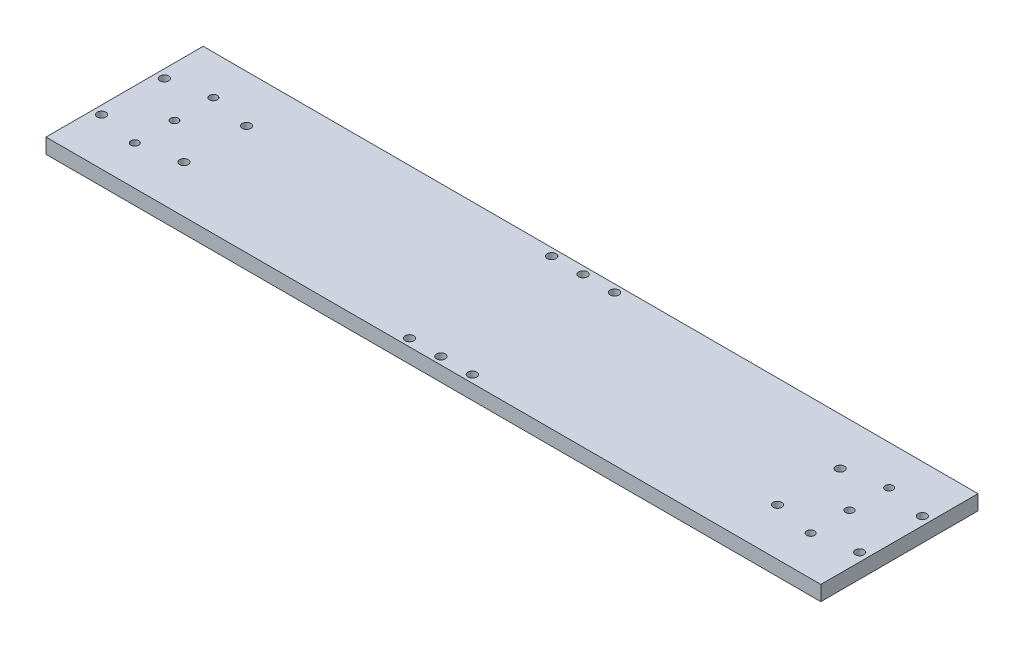
ISO-10303-21;
HEADER;
FILE_DESCRIPTION(('STEP AP214'),'2;1');
FILE_NAME('part.step','',(''),(''),'','','');
FILE_SCHEMA(('AUTOMOTIVE_DESIGN { 1 0 10303 214 1 1 1 1 }'));
ENDSEC;
DATA;
#1=APPLICATION_CONTEXT('core data for automotive mechanical design processes');
#2=APPLICATION_PROTOCOL_DEFINITION('international standard','automotive_design',2000,#1);
#3=PRODUCT_CONTEXT('',#1,'mechanical');
#4=PRODUCT('Part','Part','',(#3));
#5=PRODUCT_RELATED_PRODUCT_CATEGORY('part','',(#4));
#6=PRODUCT_DEFINITION_FORMATION('','',#4);
#7=PRODUCT_DEFINITION_CONTEXT('part definition',#1,'design');
#8=PRODUCT_DEFINITION('design','',#6,#7);
#9=PRODUCT_DEFINITION_SHAPE('','',#8);
#10=(LENGTH_UNIT() NAMED_UNIT(*) SI_UNIT(.MILLI.,.METRE.));
#11=(NAMED_UNIT(*) PLANE_ANGLE_UNIT() SI_UNIT($,.RADIAN.));
#12=(NAMED_UNIT(*) SI_UNIT($,.STERADIAN.) SOLID_ANGLE_UNIT());
#13=UNCERTAINTY_MEASURE_WITH_UNIT(LENGTH_MEASURE(1.E-05),#10,'distance_accuracy_value','');
#14=(GEOMETRIC_REPRESENTATION_CONTEXT(3) GLOBAL_UNCERTAINTY_ASSIGNED_CONTEXT((#13)) GLOBAL_UNIT_ASSIGNED_CONTEXT((#10,
#11,#12)) REPRESENTATION_CONTEXT('',''));
#15=CARTESIAN_POINT('',(0.,0.,0.));
#16=DIRECTION('',(0.,0.,1.));
#17=DIRECTION('',(1.,0.,0.));
#18=AXIS2_PLACEMENT_3D('',#15,#16,#17);
#19=CARTESIAN_POINT('',(-215.,-8.825,0.));
#20=DIRECTION('',(0.,1.,0.));
#21=DIRECTION('',(0.,0.,1.));
#22=AXIS2_PLACEMENT_3D('',#19,#20,#21);
#23=PLANE('',#22);
#24=CARTESIAN_POINT('',(-214.762500000001,-8.825,-3.71790761220109E-13));
#25=DIRECTION('',(0.,-1.,0.));
#26=DIRECTION('',(0.,0.,1.));
#27=AXIS2_PLACEMENT_3D('',#24,#25,#26);
#28=CIRCLE('',#27,4.99999999999996);
#29=CARTESIAN_POINT('',(-214.881249999992,-8.825,4.99858964483963));
#30=VERTEX_POINT('',#29);
#31=CARTESIAN_POINT('',(-214.881250000007,-8.825,-4.99858964484001));
#32=VERTEX_POINT('',#31);
#33=EDGE_CURVE('E89',#30,#32,#28,.T.);
#34=ORIENTED_EDGE('',*,*,#33,.F.);
#35=CARTESIAN_POINT('',(-215.,-8.825,0.));
#36=DIRECTION('',(0.,-1.,0.));
#37=DIRECTION('',(0.,0.,1.));
#38=AXIS2_PLACEMENT_3D('',#35,#36,#37);
#39=CIRCLE('',#38,4.99999999999999);
#40=EDGE_CURVE('E97',#30,#32,#39,.T.);
#41=ORIENTED_EDGE('',*,*,#40,.T.);
#42=EDGE_LOOP('',(#34,#41));
#43=FACE_BOUND('',#42,.T.);
#44=ADVANCED_FACE('F33',(#43),#23,.F.);
#45=CARTESIAN_POINT('',(-391.422152239449,-9.525,50.));
#46=DIRECTION('',(0.,0.,1.));
#47=DIRECTION('',(1.,0.,0.));
#48=AXIS2_PLACEMENT_3D('',#45,#46,#47);
#49=PLANE('',#48);
#50=DIRECTION('',(1.,0.,0.));
#51=VECTOR('',#50,1.);
#52=CARTESIAN_POINT('',(-391.422152239449,0.,50.));
#53=LINE('',#52,#51);
#54=CARTESIAN_POINT('',(-246.505,0.,50.));
#55=VERTEX_POINT('',#54);
#56=CARTESIAN_POINT('',(246.505,0.,50.));
#57=VERTEX_POINT('',#56);
#58=EDGE_CURVE('E191',#55,#57,#53,.T.);
#59=ORIENTED_EDGE('',*,*,#58,.F.);
#60=DIRECTION('',(0.,1.,0.));
#61=VECTOR('',#60,1.);
#62=CARTESIAN_POINT('',(-246.505,-9.525,50.));
#63=LINE('',#62,#61);
#64=CARTESIAN_POINT('',(-246.505,-9.525,50.));
#65=VERTEX_POINT('',#64);
#66=EDGE_CURVE('E11',#65,#55,#63,.T.);
#67=ORIENTED_EDGE('',*,*,#66,.F.);
#68=DIRECTION('',(1.,0.,0.));
#69=VECTOR('',#68,1.);
#70=CARTESIAN_POINT('',(-391.422152239449,-9.525,50.));
#71=LINE('',#70,#69);
#72=CARTESIAN_POINT('',(246.505,-9.525,50.));
#73=VERTEX_POINT('',#72);
#74=EDGE_CURVE('E192',#65,#73,#71,.T.);
#75=ORIENTED_EDGE('',*,*,#74,.T.);
#76=DIRECTION('',(0.,1.,0.));
#77=VECTOR('',#76,1.);
#78=CARTESIAN_POINT('',(246.505,-9.525,50.));
#79=LINE('',#78,#77);
#80=EDGE_CURVE('E203',#73,#57,#79,.T.);
#81=ORIENTED_EDGE('',*,*,#80,.T.);
#82=EDGE_LOOP('',(#59,#67,#75,#81));
#83=FACE_BOUND('',#82,.T.);
#84=ADVANCED_FACE('F35',(#83),#49,.T.);
#85=CARTESIAN_POINT('',(-246.505,-9.525,0.));
#86=DIRECTION('',(1.,0.,0.));
#87=DIRECTION('',(0.,0.,-1.));
#88=AXIS2_PLACEMENT_3D('',#85,#86,#87);
#89=PLANE('',#88);
#90=DIRECTION('',(0.,0.,-1.));
#91=VECTOR('',#90,1.);
#92=CARTESIAN_POINT('',(-246.505,0.,0.));
#93=LINE('',#92,#91);
#94=CARTESIAN_POINT('',(-246.505,0.,-50.));
#95=VERTEX_POINT('',#94);
#96=EDGE_CURVE('E196',#55,#95,#93,.T.);
#97=ORIENTED_EDGE('',*,*,#96,.T.);
#98=DIRECTION('',(0.,1.,0.));
#99=VECTOR('',#98,1.);
#100=CARTESIAN_POINT('',(-246.505,-9.525,-50.));
#101=LINE('',#100,#99);
#102=CARTESIAN_POINT('',(-246.505,-9.525,-50.));
#103=VERTEX_POINT('',#102);
#104=EDGE_CURVE('E42',#103,#95,#101,.T.);
#105=ORIENTED_EDGE('',*,*,#104,.F.);
#106=DIRECTION('',(0.,0.,-1.));
#107=VECTOR('',#106,1.);
#108=CARTESIAN_POINT('',(-246.505,-9.525,0.));
#109=LINE('',#108,#107);
#110=EDGE_CURVE('E201',#65,#103,#109,.T.);
#111=ORIENTED_EDGE('',*,*,#110,.F.);
#112=ORIENTED_EDGE('',*,*,#66,.T.);
#113=EDGE_LOOP('',(#97,#105,#111,#112));
#114=FACE_BOUND('',#113,.T.);
#115=ADVANCED_FACE('F282',(#114),#89,.F.);
#116=CARTESIAN_POINT('',(-391.422152239449,-9.525,-50.));
#117=DIRECTION('',(0.,0.,1.));
#118=DIRECTION('',(1.,0.,0.));
#119=AXIS2_PLACEMENT_3D('',#116,#117,#118);
#120=PLANE('',#119);
#121=DIRECTION('',(1.,0.,0.));
#122=VECTOR('',#121,1.);
#123=CARTESIAN_POINT('',(-391.422152239449,0.,-50.));
#124=LINE('',#123,#122);
#125=CARTESIAN_POINT('',(246.505,0.,-50.));
#126=VERTEX_POINT('',#125);
#127=EDGE_CURVE('E209',#95,#126,#124,.T.);
#128=ORIENTED_EDGE('',*,*,#127,.T.);
#129=DIRECTION('',(0.,1.,0.));
#130=VECTOR('',#129,1.);
#131=CARTESIAN_POINT('',(246.505,-9.525,-50.));
#132=LINE('',#131,#130);
#133=CARTESIAN_POINT('',(246.505,-9.525,-50.));
#134=VERTEX_POINT('',#133);
#135=EDGE_CURVE('E215',#134,#126,#132,.T.);
#136=ORIENTED_EDGE('',*,*,#135,.F.);
#137=DIRECTION('',(1.,0.,0.));
#138=VECTOR('',#137,1.);
#139=CARTESIAN_POINT('',(-391.422152239449,-9.525,-50.));
#140=LINE('',#139,#138);
#141=EDGE_CURVE('E199',#103,#134,#140,.T.);
#142=ORIENTED_EDGE('',*,*,#141,.F.);
#143=ORIENTED_EDGE('',*,*,#104,.T.);
#144=EDGE_LOOP('',(#128,#136,#142,#143));
#145=FACE_BOUND('',#144,.T.);
#146=ADVANCED_FACE('F279',(#145),#120,.F.);
#147=CARTESIAN_POINT('',(246.505,-9.525,0.));
#148=DIRECTION('',(1.,0.,0.));
#149=DIRECTION('',(0.,0.,-1.));
#150=AXIS2_PLACEMENT_3D('',#147,#148,#149);
#151=PLANE('',#150);
#152=DIRECTION('',(0.,0.,-1.));
#153=VECTOR('',#152,1.);
#154=CARTESIAN_POINT('',(246.505,0.,0.));
#155=LINE('',#154,#153);
#156=EDGE_CURVE('E206',#57,#126,#155,.T.);
#157=ORIENTED_EDGE('',*,*,#156,.F.);
#158=ORIENTED_EDGE('',*,*,#80,.F.);
#159=DIRECTION('',(0.,0.,-1.));
#160=VECTOR('',#159,1.);
#161=CARTESIAN_POINT('',(246.505,-9.525,0.));
#162=LINE('',#161,#160);
#163=EDGE_CURVE('E195',#73,#134,#162,.T.);
#164=ORIENTED_EDGE('',*,*,#163,.T.);
#165=ORIENTED_EDGE('',*,*,#135,.T.);
#166=EDGE_LOOP('',(#157,#158,#164,#165));
#167=FACE_BOUND('',#166,.T.);
#168=ADVANCED_FACE('F275',(#167),#151,.T.);
#169=CARTESIAN_POINT('',(-391.422152239449,-9.525,0.));
#170=DIRECTION('',(0.,1.,0.));
#171=DIRECTION('',(0.,0.,1.));
#172=AXIS2_PLACEMENT_3D('',#169,#170,#171);
#173=PLANE('',#172);
#174=CARTESIAN_POINT('',(-215.000000000003,-9.525,24.9999999999989));
#175=DIRECTION('',(0.,-1.,0.));
#176=DIRECTION('',(0.,0.,1.));
#177=AXIS2_PLACEMENT_3D('',#174,#175,#176);
#178=CIRCLE('',#177,5.00000000000002);
#179=CARTESIAN_POINT('',(-215.000000000003,-9.525,29.9999999999989));
#180=VERTEX_POINT('',#179);
#181=EDGE_CURVE('E109',#180,#180,#178,.T.);
#182=ORIENTED_EDGE('',*,*,#181,.F.);
#183=EDGE_LOOP('',(#182));
#184=FACE_BOUND('',#183,.T.);
#185=CARTESIAN_POINT('',(-215.,-9.525,0.));
#186=DIRECTION('',(0.,-1.,0.));
#187=DIRECTION('',(0.,0.,1.));
#188=AXIS2_PLACEMENT_3D('',#185,#186,#187);
#189=CIRCLE('',#188,4.99999999999999);
#190=CARTESIAN_POINT('',(-215.,-9.525,4.99999999999998));
#191=VERTEX_POINT('',#190);
#192=EDGE_CURVE('E99',#191,#191,#189,.T.);
#193=ORIENTED_EDGE('',*,*,#192,.F.);
#194=EDGE_LOOP('',(#193));
#195=FACE_BOUND('',#194,.T.);
#196=CARTESIAN_POINT('',(-215.000000000003,-9.525,-25.000000000001));
#197=DIRECTION('',(0.,-1.,0.));
#198=DIRECTION('',(0.,0.,1.));
#199=AXIS2_PLACEMENT_3D('',#196,#197,#198);
#200=CIRCLE('',#199,5.00000000000002);
#201=CARTESIAN_POINT('',(-215.000000000003,-9.525,-20.000000000001));
#202=VERTEX_POINT('',#201);
#203=EDGE_CURVE('E103',#202,#202,#200,.T.);
#204=ORIENTED_EDGE('',*,*,#203,.F.);
#205=EDGE_LOOP('',(#204));
#206=FACE_BOUND('',#205,.T.);
#207=CARTESIAN_POINT('',(215.000000000003,-9.525,-25.000000000001));
#208=DIRECTION('',(0.,-1.,0.));
#209=DIRECTION('',(0.,0.,-1.));
#210=AXIS2_PLACEMENT_3D('',#207,#208,#209);
#211=CIRCLE('',#210,5.00000000000002);
#212=CARTESIAN_POINT('',(215.000000000003,-9.525,-30.000000000001));
#213=VERTEX_POINT('',#212);
#214=EDGE_CURVE('E105',#213,#213,#211,.T.);
#215=ORIENTED_EDGE('',*,*,#214,.F.);
#216=EDGE_LOOP('',(#215));
#217=FACE_BOUND('',#216,.T.);
#218=CARTESIAN_POINT('',(215.,-9.525,0.));
#219=DIRECTION('',(0.,-1.,0.));
#220=DIRECTION('',(0.,0.,-1.));
#221=AXIS2_PLACEMENT_3D('',#218,#219,#220);
#222=CIRCLE('',#221,4.99999999999999);
#223=CARTESIAN_POINT('',(215.,-9.525,-5.));
#224=VERTEX_POINT('',#223);
#225=EDGE_CURVE('E115',#224,#224,#222,.T.);
#226=ORIENTED_EDGE('',*,*,#225,.F.);
#227=EDGE_LOOP('',(#226));
#228=FACE_BOUND('',#227,.T.);
#229=CARTESIAN_POINT('',(215.000000000003,-9.525,24.9999999999989));
#230=DIRECTION('',(0.,-1.,0.));
#231=DIRECTION('',(0.,0.,-1.));
#232=AXIS2_PLACEMENT_3D('',#229,#230,#231);
#233=CIRCLE('',#232,5.00000000000002);
#234=CARTESIAN_POINT('',(215.000000000003,-9.525,19.9999999999988));
#235=VERTEX_POINT('',#234);
#236=EDGE_CURVE('E118',#235,#235,#233,.T.);
#237=ORIENTED_EDGE('',*,*,#236,.F.);
#238=EDGE_LOOP('',(#237));
#239=FACE_BOUND('',#238,.T.);
#240=CARTESIAN_POINT('',(188.84,-9.525,19.9509032471845));
#241=DIRECTION('',(0.,-1.,0.));
#242=DIRECTION('',(0.,0.,1.));
#243=AXIS2_PLACEMENT_3D('',#240,#241,#242);
#244=CIRCLE('',#243,2.75000000000001);
#245=CARTESIAN_POINT('',(188.84,-9.525,22.7009032471845));
#246=VERTEX_POINT('',#245);
#247=EDGE_CURVE('E124',#246,#246,#244,.T.);
#248=ORIENTED_EDGE('',*,*,#247,.F.);
#249=EDGE_LOOP('',(#248));
#250=FACE_BOUND('',#249,.T.);
#251=CARTESIAN_POINT('',(188.84,-9.525,-19.9499999999998));
#252=DIRECTION('',(0.,-1.,0.));
#253=DIRECTION('',(0.,0.,1.));
#254=AXIS2_PLACEMENT_3D('',#251,#252,#253);
#255=CIRCLE('',#254,2.75000000000001);
#256=CARTESIAN_POINT('',(188.84,-9.525,-17.1999999999998));
#257=VERTEX_POINT('',#256);
#258=EDGE_CURVE('E127',#257,#257,#255,.T.);
#259=ORIENTED_EDGE('',*,*,#258,.F.);
#260=EDGE_LOOP('',(#259));
#261=FACE_BOUND('',#260,.T.);
#262=CARTESIAN_POINT('',(241.16,-9.525,19.9509032471845));
#263=DIRECTION('',(0.,-1.,0.));
#264=DIRECTION('',(0.,0.,1.));
#265=AXIS2_PLACEMENT_3D('',#262,#263,#264);
#266=CIRCLE('',#265,2.75000000000001);
#267=CARTESIAN_POINT('',(241.16,-9.525,22.7009032471845));
#268=VERTEX_POINT('',#267);
#269=EDGE_CURVE('E131',#268,#268,#266,.T.);
#270=ORIENTED_EDGE('',*,*,#269,.F.);
#271=EDGE_LOOP('',(#270));
#272=FACE_BOUND('',#271,.T.);
#273=CARTESIAN_POINT('',(241.16,-9.525,-19.9499999999998));
#274=DIRECTION('',(0.,-1.,0.));
#275=DIRECTION('',(0.,0.,1.));
#276=AXIS2_PLACEMENT_3D('',#273,#274,#275);
#277=CIRCLE('',#276,2.75000000000001);
#278=CARTESIAN_POINT('',(241.16,-9.525,-17.1999999999998));
#279=VERTEX_POINT('',#278);
#280=EDGE_CURVE('E135',#279,#279,#277,.T.);
#281=ORIENTED_EDGE('',*,*,#280,.F.);
#282=EDGE_LOOP('',(#281));
#283=FACE_BOUND('',#282,.T.);
#284=CARTESIAN_POINT('',(-241.16,-9.525,-19.9499999999999));
#285=DIRECTION('',(0.,-1.,0.));
#286=DIRECTION('',(0.,0.,-1.));
#287=AXIS2_PLACEMENT_3D('',#284,#285,#286);
#288=CIRCLE('',#287,2.75000000000001);
#289=CARTESIAN_POINT('',(-241.16,-9.525,-22.6999999999999));
#290=VERTEX_POINT('',#289);
#291=EDGE_CURVE('E139',#290,#290,#288,.T.);
#292=ORIENTED_EDGE('',*,*,#291,.F.);
#293=EDGE_LOOP('',(#292));
#294=FACE_BOUND('',#293,.T.);
#295=CARTESIAN_POINT('',(-241.16,-9.525,19.9509032471845));
#296=DIRECTION('',(0.,-1.,0.));
#297=DIRECTION('',(0.,0.,-1.));
#298=AXIS2_PLACEMENT_3D('',#295,#296,#297);
#299=CIRCLE('',#298,2.75000000000001);
#300=CARTESIAN_POINT('',(-241.16,-9.525,17.2009032471845));
#301=VERTEX_POINT('',#300);
#302=EDGE_CURVE('E143',#301,#301,#299,.T.);
#303=ORIENTED_EDGE('',*,*,#302,.F.);
#304=EDGE_LOOP('',(#303));
#305=FACE_BOUND('',#304,.T.);
#306=CARTESIAN_POINT('',(-188.84,-9.525,-19.9499999999999));
#307=DIRECTION('',(0.,-1.,0.));
#308=DIRECTION('',(0.,0.,-1.));
#309=AXIS2_PLACEMENT_3D('',#306,#307,#308);
#310=CIRCLE('',#309,2.75000000000001);
#311=CARTESIAN_POINT('',(-188.84,-9.525,-22.6999999999999));
#312=VERTEX_POINT('',#311);
#313=EDGE_CURVE('E147',#312,#312,#310,.T.);
#314=ORIENTED_EDGE('',*,*,#313,.F.);
#315=EDGE_LOOP('',(#314));
#316=FACE_BOUND('',#315,.T.);
#317=CARTESIAN_POINT('',(-188.84,-9.525,19.9509032471845));
#318=DIRECTION('',(0.,-1.,0.));
#319=DIRECTION('',(0.,0.,-1.));
#320=AXIS2_PLACEMENT_3D('',#317,#318,#319);
#321=CIRCLE('',#320,2.75000000000001);
#322=CARTESIAN_POINT('',(-188.84,-9.525,17.2009032471845));
#323=VERTEX_POINT('',#322);
#324=EDGE_CURVE('E151',#323,#323,#321,.T.);
#325=ORIENTED_EDGE('',*,*,#324,.F.);
#326=EDGE_LOOP('',(#325));
#327=FACE_BOUND('',#326,.T.);
#328=CARTESIAN_POINT('',(0.,-9.525,-45.235));
#329=DIRECTION('',(0.,1.,0.));
#330=DIRECTION('',(0.,0.,1.));
#331=AXIS2_PLACEMENT_3D('',#328,#329,#330);
#332=CIRCLE('',#331,2.78);
#333=CARTESIAN_POINT('',(0.,-9.525,-42.455));
#334=VERTEX_POINT('',#333);
#335=EDGE_CURVE('E158',#334,#334,#332,.T.);
#336=ORIENTED_EDGE('',*,*,#335,.T.);
#337=EDGE_LOOP('',(#336));
#338=FACE_BOUND('',#337,.T.);
#339=CARTESIAN_POINT('',(20.,-9.525,-45.235));
#340=DIRECTION('',(0.,1.,0.));
#341=DIRECTION('',(0.,0.,1.));
#342=AXIS2_PLACEMENT_3D('',#339,#340,#341);
#343=CIRCLE('',#342,2.78);
#344=CARTESIAN_POINT('',(20.,-9.525,-42.455));
#345=VERTEX_POINT('',#344);
#346=EDGE_CURVE('E164',#345,#345,#343,.T.);
#347=ORIENTED_EDGE('',*,*,#346,.T.);
#348=EDGE_LOOP('',(#347));
#349=FACE_BOUND('',#348,.T.);
#350=CARTESIAN_POINT('',(-20.,-9.525,-45.235));
#351=DIRECTION('',(0.,1.,0.));
#352=DIRECTION('',(0.,0.,1.));
#353=AXIS2_PLACEMENT_3D('',#350,#351,#352);
#354=CIRCLE('',#353,2.78);
#355=CARTESIAN_POINT('',(-20.,-9.525,-42.455));
#356=VERTEX_POINT('',#355);
#357=EDGE_CURVE('E170',#356,#356,#354,.T.);
#358=ORIENTED_EDGE('',*,*,#357,.T.);
#359=EDGE_LOOP('',(#358));
#360=FACE_BOUND('',#359,.T.);
#361=CARTESIAN_POINT('',(20.,-9.525,45.235));
#362=DIRECTION('',(0.,1.,0.));
#363=DIRECTION('',(0.,0.,1.));
#364=AXIS2_PLACEMENT_3D('',#361,#362,#363);
#365=CIRCLE('',#364,2.78);
#366=CARTESIAN_POINT('',(20.,-9.525,48.015));
#367=VERTEX_POINT('',#366);
#368=EDGE_CURVE('E176',#367,#367,#365,.T.);
#369=ORIENTED_EDGE('',*,*,#368,.T.);
#370=EDGE_LOOP('',(#369));
#371=FACE_BOUND('',#370,.T.);
#372=CARTESIAN_POINT('',(-20.,-9.525,45.235));
#373=DIRECTION('',(0.,1.,0.));
#374=DIRECTION('',(0.,0.,1.));
#375=AXIS2_PLACEMENT_3D('',#372,#373,#374);
#376=CIRCLE('',#375,2.78);
#377=CARTESIAN_POINT('',(-20.,-9.525,48.015));
#378=VERTEX_POINT('',#377);
#379=EDGE_CURVE('E182',#378,#378,#376,.T.);
#380=ORIENTED_EDGE('',*,*,#379,.T.);
#381=EDGE_LOOP('',(#380));
#382=FACE_BOUND('',#381,.T.);
#383=CARTESIAN_POINT('',(0.,-9.525,45.235));
#384=DIRECTION('',(0.,1.,0.));
#385=DIRECTION('',(0.,0.,1.));
#386=AXIS2_PLACEMENT_3D('',#383,#384,#385);
#387=CIRCLE('',#386,2.78);
#388=CARTESIAN_POINT('',(0.,-9.525,48.015));
#389=VERTEX_POINT('',#388);
#390=EDGE_CURVE('E188',#389,#389,#387,.T.);
#391=ORIENTED_EDGE('',*,*,#390,.T.);
#392=EDGE_LOOP('',(#391));
#393=FACE_BOUND('',#392,.T.);
#394=ORIENTED_EDGE('',*,*,#74,.F.);
#395=ORIENTED_EDGE('',*,*,#110,.T.);
#396=ORIENTED_EDGE('',*,*,#141,.T.);
#397=ORIENTED_EDGE('',*,*,#163,.F.);
#398=EDGE_LOOP('',(#394,#395,#396,#397));
#399=FACE_BOUND('',#398,.T.);
#400=ADVANCED_FACE('F239',(#184,#195,#206,#217,#228,#239,#250,#261,#272,#283,#294,#305,#316,
#327,#338,#349,#360,#371,#382,#393,#399),#173,.F.);
#401=CARTESIAN_POINT('',(-391.422152239449,0.,0.));
#402=DIRECTION('',(0.,1.,0.));
#403=DIRECTION('',(0.,0.,1.));
#404=AXIS2_PLACEMENT_3D('',#401,#402,#403);
#405=PLANE('',#404);
#406=CARTESIAN_POINT('',(-215.000000000003,0.,24.9999999999989));
#407=DIRECTION('',(0.,1.,0.));
#408=DIRECTION('',(0.,0.,1.));
#409=AXIS2_PLACEMENT_3D('',#406,#407,#408);
#410=CIRCLE('',#409,2.5);
#411=CARTESIAN_POINT('',(-215.000000000003,0.,27.4999999999989));
#412=VERTEX_POINT('',#411);
#413=EDGE_CURVE('E717',#412,#412,#410,.T.);
#414=ORIENTED_EDGE('',*,*,#413,.F.);
#415=EDGE_LOOP('',(#414));
#416=FACE_BOUND('',#415,.T.);
#417=CARTESIAN_POINT('',(-214.762500000001,0.,-3.19189119579733E-13));
#418=DIRECTION('',(0.,1.,0.));
#419=DIRECTION('',(0.,0.,1.));
#420=AXIS2_PLACEMENT_3D('',#417,#418,#419);
#421=CIRCLE('',#420,2.5);
#422=CARTESIAN_POINT('',(-214.762500000001,0.,2.49999999999968));
#423=VERTEX_POINT('',#422);
#424=EDGE_CURVE('E727',#423,#423,#421,.T.);
#425=ORIENTED_EDGE('',*,*,#424,.F.);
#426=EDGE_LOOP('',(#425));
#427=FACE_BOUND('',#426,.T.);
#428=CARTESIAN_POINT('',(-215.000000000003,0.,-25.000000000001));
#429=DIRECTION('',(0.,1.,0.));
#430=DIRECTION('',(0.,0.,1.));
#431=AXIS2_PLACEMENT_3D('',#428,#429,#430);
#432=CIRCLE('',#431,2.5);
#433=CARTESIAN_POINT('',(-215.000000000003,0.,-22.500000000001));
#434=VERTEX_POINT('',#433);
#435=EDGE_CURVE('E733',#434,#434,#432,.T.);
#436=ORIENTED_EDGE('',*,*,#435,.F.);
#437=EDGE_LOOP('',(#436));
#438=FACE_BOUND('',#437,.T.);
#439=CARTESIAN_POINT('',(215.000000000003,0.,-25.000000000001));
#440=DIRECTION('',(0.,1.,0.));
#441=DIRECTION('',(0.,0.,1.));
#442=AXIS2_PLACEMENT_3D('',#439,#440,#441);
#443=CIRCLE('',#442,2.5);
#444=CARTESIAN_POINT('',(215.000000000003,0.,-22.500000000001));
#445=VERTEX_POINT('',#444);
#446=EDGE_CURVE('E739',#445,#445,#443,.T.);
#447=ORIENTED_EDGE('',*,*,#446,.F.);
#448=EDGE_LOOP('',(#447));
#449=FACE_BOUND('',#448,.T.);
#450=CARTESIAN_POINT('',(214.762500000001,0.,-3.19189119579733E-13));
#451=DIRECTION('',(0.,1.,0.));
#452=DIRECTION('',(0.,0.,1.));
#453=AXIS2_PLACEMENT_3D('',#450,#451,#452);
#454=CIRCLE('',#453,2.5);
#455=CARTESIAN_POINT('',(214.762500000001,0.,2.49999999999968));
#456=VERTEX_POINT('',#455);
#457=EDGE_CURVE('E745',#456,#456,#454,.T.);
#458=ORIENTED_EDGE('',*,*,#457,.F.);
#459=EDGE_LOOP('',(#458));
#460=FACE_BOUND('',#459,.T.);
#461=CARTESIAN_POINT('',(215.000000000003,0.,24.9999999999989));
#462=DIRECTION('',(0.,1.,0.));
#463=DIRECTION('',(0.,0.,1.));
#464=AXIS2_PLACEMENT_3D('',#461,#462,#463);
#465=CIRCLE('',#464,2.5);
#466=CARTESIAN_POINT('',(215.000000000003,0.,27.4999999999989));
#467=VERTEX_POINT('',#466);
#468=EDGE_CURVE('E751',#467,#467,#465,.T.);
#469=ORIENTED_EDGE('',*,*,#468,.F.);
#470=EDGE_LOOP('',(#469));
#471=FACE_BOUND('',#470,.T.);
#472=CARTESIAN_POINT('',(188.84,0.,19.9509032471845));
#473=DIRECTION('',(0.,1.,0.));
#474=DIRECTION('',(0.,0.,1.));
#475=AXIS2_PLACEMENT_3D('',#472,#473,#474);
#476=CIRCLE('',#475,2.75000000000001);
#477=CARTESIAN_POINT('',(188.84,0.,22.7009032471845));
#478=VERTEX_POINT('',#477);
#479=EDGE_CURVE('E37',#478,#478,#476,.T.);
#480=ORIENTED_EDGE('',*,*,#479,.F.);
#481=EDGE_LOOP('',(#480));
#482=FACE_BOUND('',#481,.T.);
#483=CARTESIAN_POINT('',(188.84,0.,-19.9499999999998));
#484=DIRECTION('',(0.,1.,0.));
#485=DIRECTION('',(0.,0.,1.));
#486=AXIS2_PLACEMENT_3D('',#483,#484,#485);
#487=CIRCLE('',#486,2.75000000000001);
#488=CARTESIAN_POINT('',(188.84,0.,-17.1999999999998));
#489=VERTEX_POINT('',#488);
#490=EDGE_CURVE('E130',#489,#489,#487,.T.);
#491=ORIENTED_EDGE('',*,*,#490,.F.);
#492=EDGE_LOOP('',(#491));
#493=FACE_BOUND('',#492,.T.);
#494=CARTESIAN_POINT('',(241.16,0.,19.9509032471845));
#495=DIRECTION('',(0.,1.,0.));
#496=DIRECTION('',(0.,0.,1.));
#497=AXIS2_PLACEMENT_3D('',#494,#495,#496);
#498=CIRCLE('',#497,2.75000000000001);
#499=CARTESIAN_POINT('',(241.16,0.,22.7009032471845));
#500=VERTEX_POINT('',#499);
#501=EDGE_CURVE('E134',#500,#500,#498,.T.);
#502=ORIENTED_EDGE('',*,*,#501,.F.);
#503=EDGE_LOOP('',(#502));
#504=FACE_BOUND('',#503,.T.);
#505=CARTESIAN_POINT('',(241.16,0.,-19.9499999999998));
#506=DIRECTION('',(0.,1.,0.));
#507=DIRECTION('',(0.,0.,1.));
#508=AXIS2_PLACEMENT_3D('',#505,#506,#507);
#509=CIRCLE('',#508,2.75000000000001);
#510=CARTESIAN_POINT('',(241.16,0.,-17.1999999999998));
#511=VERTEX_POINT('',#510);
#512=EDGE_CURVE('E138',#511,#511,#509,.T.);
#513=ORIENTED_EDGE('',*,*,#512,.F.);
#514=EDGE_LOOP('',(#513));
#515=FACE_BOUND('',#514,.T.);
#516=CARTESIAN_POINT('',(-241.16,0.,-19.9499999999999));
#517=DIRECTION('',(0.,1.,0.));
#518=DIRECTION('',(0.,0.,1.));
#519=AXIS2_PLACEMENT_3D('',#516,#517,#518);
#520=CIRCLE('',#519,2.75000000000001);
#521=CARTESIAN_POINT('',(-241.16,0.,-17.1999999999999));
#522=VERTEX_POINT('',#521);
#523=EDGE_CURVE('E142',#522,#522,#520,.T.);
#524=ORIENTED_EDGE('',*,*,#523,.F.);
#525=EDGE_LOOP('',(#524));
#526=FACE_BOUND('',#525,.T.);
#527=CARTESIAN_POINT('',(-241.16,0.,19.9509032471845));
#528=DIRECTION('',(0.,1.,0.));
#529=DIRECTION('',(0.,0.,1.));
#530=AXIS2_PLACEMENT_3D('',#527,#528,#529);
#531=CIRCLE('',#530,2.75000000000001);
#532=CARTESIAN_POINT('',(-241.16,0.,22.7009032471845));
#533=VERTEX_POINT('',#532);
#534=EDGE_CURVE('E146',#533,#533,#531,.T.);
#535=ORIENTED_EDGE('',*,*,#534,.F.);
#536=EDGE_LOOP('',(#535));
#537=FACE_BOUND('',#536,.T.);
#538=CARTESIAN_POINT('',(-188.84,0.,-19.9499999999999));
#539=DIRECTION('',(0.,1.,0.));
#540=DIRECTION('',(0.,0.,1.));
#541=AXIS2_PLACEMENT_3D('',#538,#539,#540);
#542=CIRCLE('',#541,2.75000000000001);
#543=CARTESIAN_POINT('',(-188.84,0.,-17.1999999999999));
#544=VERTEX_POINT('',#543);
#545=EDGE_CURVE('E150',#544,#544,#542,.T.);
#546=ORIENTED_EDGE('',*,*,#545,.F.);
#547=EDGE_LOOP('',(#546));
#548=FACE_BOUND('',#547,.T.);
#549=CARTESIAN_POINT('',(-188.84,0.,19.9509032471845));
#550=DIRECTION('',(0.,1.,0.));
#551=DIRECTION('',(0.,0.,1.));
#552=AXIS2_PLACEMENT_3D('',#549,#550,#551);
#553=CIRCLE('',#552,2.75000000000001);
#554=CARTESIAN_POINT('',(-188.84,0.,22.7009032471845));
#555=VERTEX_POINT('',#554);
#556=EDGE_CURVE('E154',#555,#555,#553,.T.);
#557=ORIENTED_EDGE('',*,*,#556,.F.);
#558=EDGE_LOOP('',(#557));
#559=FACE_BOUND('',#558,.T.);
#560=CARTESIAN_POINT('',(0.,0.,-45.235));
#561=DIRECTION('',(0.,1.,0.));
#562=DIRECTION('',(0.,0.,-1.));
#563=AXIS2_PLACEMENT_3D('',#560,#561,#562);
#564=CIRCLE('',#563,2.78);
#565=CARTESIAN_POINT('',(0.,0.,-48.015));
#566=VERTEX_POINT('',#565);
#567=EDGE_CURVE('E155',#566,#566,#564,.T.);
#568=ORIENTED_EDGE('',*,*,#567,.F.);
#569=EDGE_LOOP('',(#568));
#570=FACE_BOUND('',#569,.T.);
#571=CARTESIAN_POINT('',(20.,0.,-45.235));
#572=DIRECTION('',(0.,1.,0.));
#573=DIRECTION('',(0.,0.,-1.));
#574=AXIS2_PLACEMENT_3D('',#571,#572,#573);
#575=CIRCLE('',#574,2.78);
#576=CARTESIAN_POINT('',(20.,0.,-48.015));
#577=VERTEX_POINT('',#576);
#578=EDGE_CURVE('E161',#577,#577,#575,.T.);
#579=ORIENTED_EDGE('',*,*,#578,.F.);
#580=EDGE_LOOP('',(#579));
#581=FACE_BOUND('',#580,.T.);
#582=CARTESIAN_POINT('',(-20.,0.,-45.235));
#583=DIRECTION('',(0.,1.,0.));
#584=DIRECTION('',(0.,0.,-1.));
#585=AXIS2_PLACEMENT_3D('',#582,#583,#584);
#586=CIRCLE('',#585,2.78);
#587=CARTESIAN_POINT('',(-20.,0.,-48.015));
#588=VERTEX_POINT('',#587);
#589=EDGE_CURVE('E167',#588,#588,#586,.T.);
#590=ORIENTED_EDGE('',*,*,#589,.F.);
#591=EDGE_LOOP('',(#590));
#592=FACE_BOUND('',#591,.T.);
#593=CARTESIAN_POINT('',(20.,0.,45.235));
#594=DIRECTION('',(0.,1.,0.));
#595=DIRECTION('',(0.,0.,1.));
#596=AXIS2_PLACEMENT_3D('',#593,#594,#595);
#597=CIRCLE('',#596,2.78);
#598=CARTESIAN_POINT('',(20.,0.,48.015));
#599=VERTEX_POINT('',#598);
#600=EDGE_CURVE('E173',#599,#599,#597,.T.);
#601=ORIENTED_EDGE('',*,*,#600,.F.);
#602=EDGE_LOOP('',(#601));
#603=FACE_BOUND('',#602,.T.);
#604=CARTESIAN_POINT('',(-20.,0.,45.235));
#605=DIRECTION('',(0.,1.,0.));
#606=DIRECTION('',(0.,0.,1.));
#607=AXIS2_PLACEMENT_3D('',#604,#605,#606);
#608=CIRCLE('',#607,2.78);
#609=CARTESIAN_POINT('',(-20.,0.,48.015));
#610=VERTEX_POINT('',#609);
#611=EDGE_CURVE('E179',#610,#610,#608,.T.);
#612=ORIENTED_EDGE('',*,*,#611,.F.);
#613=EDGE_LOOP('',(#612));
#614=FACE_BOUND('',#613,.T.);
#615=CARTESIAN_POINT('',(0.,0.,45.235));
#616=DIRECTION('',(0.,1.,0.));
#617=DIRECTION('',(0.,0.,1.));
#618=AXIS2_PLACEMENT_3D('',#615,#616,#617);
#619=CIRCLE('',#618,2.78);
#620=CARTESIAN_POINT('',(0.,0.,48.015));
#621=VERTEX_POINT('',#620);
#622=EDGE_CURVE('E185',#621,#621,#619,.T.);
#623=ORIENTED_EDGE('',*,*,#622,.F.);
#624=EDGE_LOOP('',(#623));
#625=FACE_BOUND('',#624,.T.);
#626=ORIENTED_EDGE('',*,*,#58,.T.);
#627=ORIENTED_EDGE('',*,*,#156,.T.);
#628=ORIENTED_EDGE('',*,*,#127,.F.);
#629=ORIENTED_EDGE('',*,*,#96,.F.);
#630=EDGE_LOOP('',(#626,#627,#628,#629));
#631=FACE_BOUND('',#630,.T.);
#632=ADVANCED_FACE('F235',(#416,#427,#438,#449,#460,#471,#482,#493,#504,#515,#526,#537,#548,
#559,#570,#581,#592,#603,#614,#625,#631),#405,.T.);
#633=CARTESIAN_POINT('',(0.,-10.,45.235));
#634=DIRECTION('',(0.,1.,0.));
#635=DIRECTION('',(0.,0.,1.));
#636=AXIS2_PLACEMENT_3D('',#633,#634,#635);
#637=CYLINDRICAL_SURFACE('',#636,2.78);
#638=ORIENTED_EDGE('',*,*,#622,.T.);
#639=EDGE_LOOP('',(#638));
#640=FACE_BOUND('',#639,.T.);
#641=ORIENTED_EDGE('',*,*,#390,.F.);
#642=EDGE_LOOP('',(#641));
#643=FACE_BOUND('',#642,.T.);
#644=ADVANCED_FACE('F238',(#640,#643),#637,.F.);
#645=CARTESIAN_POINT('',(-20.,-10.,45.235));
#646=DIRECTION('',(0.,1.,0.));
#647=DIRECTION('',(0.,0.,1.));
#648=AXIS2_PLACEMENT_3D('',#645,#646,#647);
#649=CYLINDRICAL_SURFACE('',#648,2.78);
#650=ORIENTED_EDGE('',*,*,#611,.T.);
#651=EDGE_LOOP('',(#650));
#652=FACE_BOUND('',#651,.T.);
#653=ORIENTED_EDGE('',*,*,#379,.F.);
#654=EDGE_LOOP('',(#653));
#655=FACE_BOUND('',#654,.T.);
#656=ADVANCED_FACE('F369',(#652,#655),#649,.F.);
#657=CARTESIAN_POINT('',(20.,-10.,45.235));
#658=DIRECTION('',(0.,1.,0.));
#659=DIRECTION('',(0.,0.,1.));
#660=AXIS2_PLACEMENT_3D('',#657,#658,#659);
#661=CYLINDRICAL_SURFACE('',#660,2.78);
#662=ORIENTED_EDGE('',*,*,#600,.T.);
#663=EDGE_LOOP('',(#662));
#664=FACE_BOUND('',#663,.T.);
#665=ORIENTED_EDGE('',*,*,#368,.F.);
#666=EDGE_LOOP('',(#665));
#667=FACE_BOUND('',#666,.T.);
#668=ADVANCED_FACE('F365',(#664,#667),#661,.F.);
#669=CARTESIAN_POINT('',(-20.,-10.,-45.235));
#670=DIRECTION('',(0.,1.,0.));
#671=DIRECTION('',(0.,0.,1.));
#672=AXIS2_PLACEMENT_3D('',#669,#670,#671);
#673=CYLINDRICAL_SURFACE('',#672,2.78);
#674=ORIENTED_EDGE('',*,*,#589,.T.);
#675=EDGE_LOOP('',(#674));
#676=FACE_BOUND('',#675,.T.);
#677=ORIENTED_EDGE('',*,*,#357,.F.);
#678=EDGE_LOOP('',(#677));
#679=FACE_BOUND('',#678,.T.);
#680=ADVANCED_FACE('F361',(#676,#679),#673,.F.);
#681=CARTESIAN_POINT('',(20.,-10.,-45.235));
#682=DIRECTION('',(0.,1.,0.));
#683=DIRECTION('',(0.,0.,1.));
#684=AXIS2_PLACEMENT_3D('',#681,#682,#683);
#685=CYLINDRICAL_SURFACE('',#684,2.78);
#686=ORIENTED_EDGE('',*,*,#578,.T.);
#687=EDGE_LOOP('',(#686));
#688=FACE_BOUND('',#687,.T.);
#689=ORIENTED_EDGE('',*,*,#346,.F.);
#690=EDGE_LOOP('',(#689));
#691=FACE_BOUND('',#690,.T.);
#692=ADVANCED_FACE('F357',(#688,#691),#685,.F.);
#693=CARTESIAN_POINT('',(0.,-10.,-45.235));
#694=DIRECTION('',(0.,1.,0.));
#695=DIRECTION('',(0.,0.,1.));
#696=AXIS2_PLACEMENT_3D('',#693,#694,#695);
#697=CYLINDRICAL_SURFACE('',#696,2.78);
#698=ORIENTED_EDGE('',*,*,#567,.T.);
#699=EDGE_LOOP('',(#698));
#700=FACE_BOUND('',#699,.T.);
#701=ORIENTED_EDGE('',*,*,#335,.F.);
#702=EDGE_LOOP('',(#701));
#703=FACE_BOUND('',#702,.T.);
#704=ADVANCED_FACE('F353',(#700,#703),#697,.F.);
#705=CARTESIAN_POINT('',(-188.84,0.475,19.9509032471845));
#706=DIRECTION('',(0.,-1.,0.));
#707=DIRECTION('',(0.,0.,-1.));
#708=AXIS2_PLACEMENT_3D('',#705,#706,#707);
#709=CYLINDRICAL_SURFACE('',#708,2.75000000000001);
#710=ORIENTED_EDGE('',*,*,#556,.T.);
#711=EDGE_LOOP('',(#710));
#712=FACE_BOUND('',#711,.T.);
#713=ORIENTED_EDGE('',*,*,#324,.T.);
#714=EDGE_LOOP('',(#713));
#715=FACE_BOUND('',#714,.T.);
#716=ADVANCED_FACE('F349',(#712,#715),#709,.F.);
#717=CARTESIAN_POINT('',(-188.84,0.475,-19.9499999999999));
#718=DIRECTION('',(0.,-1.,0.));
#719=DIRECTION('',(0.,0.,-1.));
#720=AXIS2_PLACEMENT_3D('',#717,#718,#719);
#721=CYLINDRICAL_SURFACE('',#720,2.75000000000001);
#722=ORIENTED_EDGE('',*,*,#545,.T.);
#723=EDGE_LOOP('',(#722));
#724=FACE_BOUND('',#723,.T.);
#725=ORIENTED_EDGE('',*,*,#313,.T.);
#726=EDGE_LOOP('',(#725));
#727=FACE_BOUND('',#726,.T.);
#728=ADVANCED_FACE('F345',(#724,#727),#721,.F.);
#729=CARTESIAN_POINT('',(-241.16,0.475,19.9509032471845));
#730=DIRECTION('',(0.,-1.,0.));
#731=DIRECTION('',(0.,0.,-1.));
#732=AXIS2_PLACEMENT_3D('',#729,#730,#731);
#733=CYLINDRICAL_SURFACE('',#732,2.75000000000001);
#734=ORIENTED_EDGE('',*,*,#534,.T.);
#735=EDGE_LOOP('',(#734));
#736=FACE_BOUND('',#735,.T.);
#737=ORIENTED_EDGE('',*,*,#302,.T.);
#738=EDGE_LOOP('',(#737));
#739=FACE_BOUND('',#738,.T.);
#740=ADVANCED_FACE('F341',(#736,#739),#733,.F.);
#741=CARTESIAN_POINT('',(-241.16,0.475,-19.9499999999999));
#742=DIRECTION('',(0.,-1.,0.));
#743=DIRECTION('',(0.,0.,-1.));
#744=AXIS2_PLACEMENT_3D('',#741,#742,#743);
#745=CYLINDRICAL_SURFACE('',#744,2.75000000000001);
#746=ORIENTED_EDGE('',*,*,#523,.T.);
#747=EDGE_LOOP('',(#746));
#748=FACE_BOUND('',#747,.T.);
#749=ORIENTED_EDGE('',*,*,#291,.T.);
#750=EDGE_LOOP('',(#749));
#751=FACE_BOUND('',#750,.T.);
#752=ADVANCED_FACE('F337',(#748,#751),#745,.F.);
#753=CARTESIAN_POINT('',(241.16,0.475,-19.9499999999998));
#754=DIRECTION('',(0.,-1.,0.));
#755=DIRECTION('',(0.,0.,-1.));
#756=AXIS2_PLACEMENT_3D('',#753,#754,#755);
#757=CYLINDRICAL_SURFACE('',#756,2.75000000000001);
#758=ORIENTED_EDGE('',*,*,#512,.T.);
#759=EDGE_LOOP('',(#758));
#760=FACE_BOUND('',#759,.T.);
#761=ORIENTED_EDGE('',*,*,#280,.T.);
#762=EDGE_LOOP('',(#761));
#763=FACE_BOUND('',#762,.T.);
#764=ADVANCED_FACE('F333',(#760,#763),#757,.F.);
#765=CARTESIAN_POINT('',(241.16,0.475,19.9509032471845));
#766=DIRECTION('',(0.,-1.,0.));
#767=DIRECTION('',(0.,0.,-1.));
#768=AXIS2_PLACEMENT_3D('',#765,#766,#767);
#769=CYLINDRICAL_SURFACE('',#768,2.75000000000001);
#770=ORIENTED_EDGE('',*,*,#501,.T.);
#771=EDGE_LOOP('',(#770));
#772=FACE_BOUND('',#771,.T.);
#773=ORIENTED_EDGE('',*,*,#269,.T.);
#774=EDGE_LOOP('',(#773));
#775=FACE_BOUND('',#774,.T.);
#776=ADVANCED_FACE('F330',(#772,#775),#769,.F.);
#777=CARTESIAN_POINT('',(188.84,0.475,-19.9499999999998));
#778=DIRECTION('',(0.,-1.,0.));
#779=DIRECTION('',(0.,0.,-1.));
#780=AXIS2_PLACEMENT_3D('',#777,#778,#779);
#781=CYLINDRICAL_SURFACE('',#780,2.75000000000001);
#782=ORIENTED_EDGE('',*,*,#490,.T.);
#783=EDGE_LOOP('',(#782));
#784=FACE_BOUND('',#783,.T.);
#785=ORIENTED_EDGE('',*,*,#258,.T.);
#786=EDGE_LOOP('',(#785));
#787=FACE_BOUND('',#786,.T.);
#788=ADVANCED_FACE('F232',(#784,#787),#781,.F.);
#789=CARTESIAN_POINT('',(188.84,0.475,19.9509032471845));
#790=DIRECTION('',(0.,-1.,0.));
#791=DIRECTION('',(0.,0.,-1.));
#792=AXIS2_PLACEMENT_3D('',#789,#790,#791);
#793=CYLINDRICAL_SURFACE('',#792,2.75000000000001);
#794=ORIENTED_EDGE('',*,*,#479,.T.);
#795=EDGE_LOOP('',(#794));
#796=FACE_BOUND('',#795,.T.);
#797=ORIENTED_EDGE('',*,*,#247,.T.);
#798=EDGE_LOOP('',(#797));
#799=FACE_BOUND('',#798,.T.);
#800=ADVANCED_FACE('F323',(#796,#799),#793,.F.);
#801=CARTESIAN_POINT('',(215.000000000003,-8.825,24.9999999999989));
#802=DIRECTION('',(0.,-1.,0.));
#803=DIRECTION('',(0.,0.,-1.));
#804=AXIS2_PLACEMENT_3D('',#801,#802,#803);
#805=CYLINDRICAL_SURFACE('',#804,5.00000000000002);
#806=CARTESIAN_POINT('',(215.000000000003,-8.825,24.9999999999989));
#807=DIRECTION('',(0.,-1.,0.));
#808=DIRECTION('',(0.,0.,-1.));
#809=AXIS2_PLACEMENT_3D('',#806,#807,#808);
#810=CIRCLE('',#809,5.00000000000002);
#811=CARTESIAN_POINT('',(215.000000000003,-8.825,19.9999999999988));
#812=VERTEX_POINT('',#811);
#813=EDGE_CURVE('E762',#812,#812,#810,.T.);
#814=ORIENTED_EDGE('',*,*,#813,.F.);
#815=EDGE_LOOP('',(#814));
#816=FACE_BOUND('',#815,.T.);
#817=ORIENTED_EDGE('',*,*,#236,.T.);
#818=EDGE_LOOP('',(#817));
#819=FACE_BOUND('',#818,.T.);
#820=ADVANCED_FACE('F319',(#816,#819),#805,.F.);
#821=CARTESIAN_POINT('',(215.,-8.825,0.));
#822=DIRECTION('',(0.,-1.,0.));
#823=DIRECTION('',(0.,0.,-1.));
#824=AXIS2_PLACEMENT_3D('',#821,#822,#823);
#825=CYLINDRICAL_SURFACE('',#824,4.99999999999999);
#826=CARTESIAN_POINT('',(215.,-8.825,0.));
#827=DIRECTION('',(0.,-1.,0.));
#828=DIRECTION('',(0.,0.,-1.));
#829=AXIS2_PLACEMENT_3D('',#826,#827,#828);
#830=CIRCLE('',#829,4.99999999999999);
#831=CARTESIAN_POINT('',(214.881249999993,-8.825,4.99858964483966));
#832=VERTEX_POINT('',#831);
#833=CARTESIAN_POINT('',(214.881250000006,-8.825,-4.99858964483998));
#834=VERTEX_POINT('',#833);
#835=EDGE_CURVE('E116',#832,#834,#830,.T.);
#836=ORIENTED_EDGE('',*,*,#835,.F.);
#837=EDGE_CURVE('E119',#834,#832,#830,.T.);
#838=ORIENTED_EDGE('',*,*,#837,.F.);
#839=EDGE_LOOP('',(#836,#838));
#840=FACE_BOUND('',#839,.T.);
#841=ORIENTED_EDGE('',*,*,#225,.T.);
#842=EDGE_LOOP('',(#841));
#843=FACE_BOUND('',#842,.T.);
#844=ADVANCED_FACE('F315',(#840,#843),#825,.F.);
#845=CARTESIAN_POINT('',(215.,-8.825,0.));
#846=DIRECTION('',(0.,-1.,0.));
#847=DIRECTION('',(0.,0.,-1.));
#848=AXIS2_PLACEMENT_3D('',#845,#846,#847);
#849=PLANE('',#848);
#850=CARTESIAN_POINT('',(214.762500000001,-8.825,-3.19189119579733E-13));
#851=DIRECTION('',(0.,-1.,0.));
#852=DIRECTION('',(0.,0.,-1.));
#853=AXIS2_PLACEMENT_3D('',#850,#851,#852);
#854=CIRCLE('',#853,4.99999999999996);
#855=EDGE_CURVE('E761',#834,#832,#854,.T.);
#856=ORIENTED_EDGE('',*,*,#855,.F.);
#857=ORIENTED_EDGE('',*,*,#837,.T.);
#858=EDGE_LOOP('',(#856,#857));
#859=FACE_BOUND('',#858,.T.);
#860=ADVANCED_FACE('F311',(#859),#849,.T.);
#861=CARTESIAN_POINT('',(215.000000000003,-8.825,-25.000000000001));
#862=DIRECTION('',(0.,-1.,0.));
#863=DIRECTION('',(0.,0.,-1.));
#864=AXIS2_PLACEMENT_3D('',#861,#862,#863);
#865=CYLINDRICAL_SURFACE('',#864,5.00000000000002);
#866=CARTESIAN_POINT('',(215.000000000003,-8.825,-25.000000000001));
#867=DIRECTION('',(0.,-1.,0.));
#868=DIRECTION('',(0.,0.,-1.));
#869=AXIS2_PLACEMENT_3D('',#866,#867,#868);
#870=CIRCLE('',#869,5.00000000000002);
#871=CARTESIAN_POINT('',(215.000000000003,-8.825,-30.000000000001));
#872=VERTEX_POINT('',#871);
#873=EDGE_CURVE('E758',#872,#872,#870,.T.);
#874=ORIENTED_EDGE('',*,*,#873,.F.);
#875=EDGE_LOOP('',(#874));
#876=FACE_BOUND('',#875,.T.);
#877=ORIENTED_EDGE('',*,*,#214,.T.);
#878=EDGE_LOOP('',(#877));
#879=FACE_BOUND('',#878,.T.);
#880=ADVANCED_FACE('F307',(#876,#879),#865,.F.);
#881=CARTESIAN_POINT('',(-215.000000000003,-8.825,-25.000000000001));
#882=DIRECTION('',(0.,-1.,0.));
#883=DIRECTION('',(0.,0.,-1.));
#884=AXIS2_PLACEMENT_3D('',#881,#882,#883);
#885=CYLINDRICAL_SURFACE('',#884,5.00000000000002);
#886=CARTESIAN_POINT('',(-215.000000000003,-8.825,-25.000000000001));
#887=DIRECTION('',(0.,-1.,0.));
#888=DIRECTION('',(0.,0.,1.));
#889=AXIS2_PLACEMENT_3D('',#886,#887,#888);
#890=CIRCLE('',#889,5.00000000000002);
#891=CARTESIAN_POINT('',(-215.000000000003,-8.825,-20.000000000001));
#892=VERTEX_POINT('',#891);
#893=EDGE_CURVE('E96',#892,#892,#890,.T.);
#894=ORIENTED_EDGE('',*,*,#893,.F.);
#895=EDGE_LOOP('',(#894));
#896=FACE_BOUND('',#895,.T.);
#897=ORIENTED_EDGE('',*,*,#203,.T.);
#898=EDGE_LOOP('',(#897));
#899=FACE_BOUND('',#898,.T.);
#900=ADVANCED_FACE('F304',(#896,#899),#885,.F.);
#901=CARTESIAN_POINT('',(-215.,-8.825,0.));
#902=DIRECTION('',(0.,-1.,0.));
#903=DIRECTION('',(0.,0.,-1.));
#904=AXIS2_PLACEMENT_3D('',#901,#902,#903);
#905=CYLINDRICAL_SURFACE('',#904,4.99999999999999);
#906=EDGE_CURVE('E87',#32,#30,#39,.T.);
#907=ORIENTED_EDGE('',*,*,#906,.F.);
#908=ORIENTED_EDGE('',*,*,#40,.F.);
#909=EDGE_LOOP('',(#907,#908));
#910=FACE_BOUND('',#909,.T.);
#911=ORIENTED_EDGE('',*,*,#192,.T.);
#912=EDGE_LOOP('',(#911));
#913=FACE_BOUND('',#912,.T.);
#914=ADVANCED_FACE('F101',(#910,#913),#905,.F.);
#915=CARTESIAN_POINT('',(-215.000000000003,-8.825,24.9999999999989));
#916=DIRECTION('',(0.,-1.,0.));
#917=DIRECTION('',(0.,0.,-1.));
#918=AXIS2_PLACEMENT_3D('',#915,#916,#917);
#919=CYLINDRICAL_SURFACE('',#918,5.00000000000002);
#920=CARTESIAN_POINT('',(-215.000000000003,-8.825,24.9999999999989));
#921=DIRECTION('',(0.,-1.,0.));
#922=DIRECTION('',(0.,0.,1.));
#923=AXIS2_PLACEMENT_3D('',#920,#921,#922);
#924=CIRCLE('',#923,5.00000000000002);
#925=CARTESIAN_POINT('',(-215.000000000003,-8.825,29.9999999999989));
#926=VERTEX_POINT('',#925);
#927=EDGE_CURVE('E90',#926,#926,#924,.T.);
#928=ORIENTED_EDGE('',*,*,#927,.F.);
#929=EDGE_LOOP('',(#928));
#930=FACE_BOUND('',#929,.T.);
#931=ORIENTED_EDGE('',*,*,#181,.T.);
#932=EDGE_LOOP('',(#931));
#933=FACE_BOUND('',#932,.T.);
#934=ADVANCED_FACE('F300',(#930,#933),#919,.F.);
#935=CARTESIAN_POINT('',(215.000000000003,-8.825,24.9999999999989));
#936=DIRECTION('',(0.,-1.,0.));
#937=DIRECTION('',(0.,0.,-1.));
#938=AXIS2_PLACEMENT_3D('',#935,#936,#937);
#939=CONICAL_SURFACE('',#938,5.00000000000002,0.78539816339745);
#940=CARTESIAN_POINT('',(215.000000000003,-6.325,24.9999999999989));
#941=DIRECTION('',(0.,-1.,0.));
#942=DIRECTION('',(0.,0.,-1.));
#943=AXIS2_PLACEMENT_3D('',#940,#941,#942);
#944=CIRCLE('',#943,2.5);
#945=CARTESIAN_POINT('',(215.000000000003,-6.325,22.4999999999989));
#946=VERTEX_POINT('',#945);
#947=EDGE_CURVE('E748',#946,#946,#944,.T.);
#948=ORIENTED_EDGE('',*,*,#947,.F.);
#949=EDGE_LOOP('',(#948));
#950=FACE_BOUND('',#949,.T.);
#951=ORIENTED_EDGE('',*,*,#813,.T.);
#952=EDGE_LOOP('',(#951));
#953=FACE_BOUND('',#952,.T.);
#954=ADVANCED_FACE('F466',(#950,#953),#939,.F.);
#955=CARTESIAN_POINT('',(214.762500000001,-8.825,-3.19189119579733E-13));
#956=DIRECTION('',(0.,-1.,0.));
#957=DIRECTION('',(0.,0.,-1.));
#958=AXIS2_PLACEMENT_3D('',#955,#956,#957);
#959=CONICAL_SURFACE('',#958,4.99999999999996,0.78539816339745);
#960=CARTESIAN_POINT('',(214.762500000001,-6.325,-3.19189119579733E-13));
#961=DIRECTION('',(0.,-1.,0.));
#962=DIRECTION('',(0.,0.,-1.));
#963=AXIS2_PLACEMENT_3D('',#960,#961,#962);
#964=CIRCLE('',#963,2.5);
#965=CARTESIAN_POINT('',(214.762500000001,-6.325,-2.50000000000031));
#966=VERTEX_POINT('',#965);
#967=EDGE_CURVE('E742',#966,#966,#964,.T.);
#968=ORIENTED_EDGE('',*,*,#967,.F.);
#969=EDGE_LOOP('',(#968));
#970=FACE_BOUND('',#969,.T.);
#971=ORIENTED_EDGE('',*,*,#855,.T.);
#972=EDGE_CURVE('E56',#832,#834,#854,.T.);
#973=ORIENTED_EDGE('',*,*,#972,.T.);
#974=EDGE_LOOP('',(#971,#973));
#975=FACE_BOUND('',#974,.T.);
#976=ADVANCED_FACE('F472',(#970,#975),#959,.F.);
#977=CARTESIAN_POINT('',(214.762500000001,-8.825,-3.19189119579733E-13));
#978=DIRECTION('',(0.,-1.,0.));
#979=DIRECTION('',(0.,0.,-1.));
#980=AXIS2_PLACEMENT_3D('',#977,#978,#979);
#981=PLANE('',#980);
#982=ORIENTED_EDGE('',*,*,#835,.T.);
#983=ORIENTED_EDGE('',*,*,#972,.F.);
#984=EDGE_LOOP('',(#982,#983));
#985=FACE_BOUND('',#984,.T.);
#986=ADVANCED_FACE('F479',(#985),#981,.F.);
#987=CARTESIAN_POINT('',(215.000000000003,-8.825,-25.000000000001));
#988=DIRECTION('',(0.,-1.,0.));
#989=DIRECTION('',(0.,0.,-1.));
#990=AXIS2_PLACEMENT_3D('',#987,#988,#989);
#991=CONICAL_SURFACE('',#990,5.00000000000002,0.78539816339745);
#992=CARTESIAN_POINT('',(215.000000000003,-6.325,-25.000000000001));
#993=DIRECTION('',(0.,-1.,0.));
#994=DIRECTION('',(0.,0.,-1.));
#995=AXIS2_PLACEMENT_3D('',#992,#993,#994);
#996=CIRCLE('',#995,2.5);
#997=CARTESIAN_POINT('',(215.000000000003,-6.325,-27.500000000001));
#998=VERTEX_POINT('',#997);
#999=EDGE_CURVE('E736',#998,#998,#996,.T.);
#1000=ORIENTED_EDGE('',*,*,#999,.F.);
#1001=EDGE_LOOP('',(#1000));
#1002=FACE_BOUND('',#1001,.T.);
#1003=ORIENTED_EDGE('',*,*,#873,.T.);
#1004=EDGE_LOOP('',(#1003));
#1005=FACE_BOUND('',#1004,.T.);
#1006=ADVANCED_FACE('F487',(#1002,#1005),#991,.F.);
#1007=CARTESIAN_POINT('',(-215.000000000003,-8.825,-25.000000000001));
#1008=DIRECTION('',(0.,-1.,0.));
#1009=DIRECTION('',(0.,0.,1.));
#1010=AXIS2_PLACEMENT_3D('',#1007,#1008,#1009);
#1011=CONICAL_SURFACE('',#1010,5.00000000000002,0.78539816339745);
#1012=CARTESIAN_POINT('',(-215.000000000003,-6.325,-25.000000000001));
#1013=DIRECTION('',(0.,1.,0.));
#1014=DIRECTION('',(0.,0.,1.));
#1015=AXIS2_PLACEMENT_3D('',#1012,#1013,#1014);
#1016=CIRCLE('',#1015,2.5);
#1017=CARTESIAN_POINT('',(-215.000000000003,-6.325,-22.500000000001));
#1018=VERTEX_POINT('',#1017);
#1019=EDGE_CURVE('E730',#1018,#1018,#1016,.T.);
#1020=ORIENTED_EDGE('',*,*,#1019,.T.);
#1021=EDGE_LOOP('',(#1020));
#1022=FACE_BOUND('',#1021,.T.);
#1023=ORIENTED_EDGE('',*,*,#893,.T.);
#1024=EDGE_LOOP('',(#1023));
#1025=FACE_BOUND('',#1024,.T.);
#1026=ADVANCED_FACE('F495',(#1022,#1025),#1011,.F.);
#1027=CARTESIAN_POINT('',(-214.762500000001,-8.825,-3.71790761220109E-13));
#1028=DIRECTION('',(0.,1.,0.));
#1029=DIRECTION('',(0.,0.,1.));
#1030=AXIS2_PLACEMENT_3D('',#1027,#1028,#1029);
#1031=PLANE('',#1030);
#1032=ORIENTED_EDGE('',*,*,#906,.T.);
#1033=EDGE_CURVE('E49',#32,#30,#28,.T.);
#1034=ORIENTED_EDGE('',*,*,#1033,.F.);
#1035=EDGE_LOOP('',(#1032,#1034));
#1036=FACE_BOUND('',#1035,.T.);
#1037=ADVANCED_FACE('F85',(#1036),#1031,.T.);
#1038=CARTESIAN_POINT('',(-214.762500000001,-8.825,-3.71790761220109E-13));
#1039=DIRECTION('',(0.,-1.,0.));
#1040=DIRECTION('',(0.,0.,1.));
#1041=AXIS2_PLACEMENT_3D('',#1038,#1039,#1040);
#1042=CONICAL_SURFACE('',#1041,4.99999999999996,0.78539816339745);
#1043=CARTESIAN_POINT('',(-214.762500000001,-6.325,-3.19189119579733E-13));
#1044=DIRECTION('',(0.,1.,0.));
#1045=DIRECTION('',(0.,0.,1.));
#1046=AXIS2_PLACEMENT_3D('',#1043,#1044,#1045);
#1047=CIRCLE('',#1046,2.5);
#1048=CARTESIAN_POINT('',(-214.762500000001,-6.325,2.49999999999968));
#1049=VERTEX_POINT('',#1048);
#1050=EDGE_CURVE('E722',#1049,#1049,#1047,.T.);
#1051=ORIENTED_EDGE('',*,*,#1050,.T.);
#1052=EDGE_LOOP('',(#1051));
#1053=FACE_BOUND('',#1052,.T.);
#1054=ORIENTED_EDGE('',*,*,#33,.T.);
#1055=ORIENTED_EDGE('',*,*,#1033,.T.);
#1056=EDGE_LOOP('',(#1054,#1055));
#1057=FACE_BOUND('',#1056,.T.);
#1058=ADVANCED_FACE('F93',(#1053,#1057),#1042,.F.);
#1059=CARTESIAN_POINT('',(-215.000000000003,-8.825,24.9999999999989));
#1060=DIRECTION('',(0.,-1.,0.));
#1061=DIRECTION('',(0.,0.,1.));
#1062=AXIS2_PLACEMENT_3D('',#1059,#1060,#1061);
#1063=CONICAL_SURFACE('',#1062,5.00000000000002,0.78539816339745);
#1064=CARTESIAN_POINT('',(-215.000000000003,-6.325,24.9999999999989));
#1065=DIRECTION('',(0.,1.,0.));
#1066=DIRECTION('',(0.,0.,1.));
#1067=AXIS2_PLACEMENT_3D('',#1064,#1065,#1066);
#1068=CIRCLE('',#1067,2.5);
#1069=CARTESIAN_POINT('',(-215.000000000003,-6.325,27.4999999999989));
#1070=VERTEX_POINT('',#1069);
#1071=EDGE_CURVE('E720',#1070,#1070,#1068,.T.);
#1072=ORIENTED_EDGE('',*,*,#1071,.T.);
#1073=EDGE_LOOP('',(#1072));
#1074=FACE_BOUND('',#1073,.T.);
#1075=ORIENTED_EDGE('',*,*,#927,.T.);
#1076=EDGE_LOOP('',(#1075));
#1077=FACE_BOUND('',#1076,.T.);
#1078=ADVANCED_FACE('F516',(#1074,#1077),#1063,.F.);
#1079=CARTESIAN_POINT('',(215.000000000003,0.475,24.9999999999989));
#1080=DIRECTION('',(0.,-1.,0.));
#1081=DIRECTION('',(0.,0.,-1.));
#1082=AXIS2_PLACEMENT_3D('',#1079,#1080,#1081);
#1083=CYLINDRICAL_SURFACE('',#1082,2.5);
#1084=ORIENTED_EDGE('',*,*,#468,.T.);
#1085=EDGE_LOOP('',(#1084));
#1086=FACE_BOUND('',#1085,.T.);
#1087=ORIENTED_EDGE('',*,*,#947,.T.);
#1088=EDGE_LOOP('',(#1087));
#1089=FACE_BOUND('',#1088,.T.);
#1090=ADVANCED_FACE('F524',(#1086,#1089),#1083,.F.);
#1091=CARTESIAN_POINT('',(214.762500000001,0.475,-3.19189119579733E-13));
#1092=DIRECTION('',(0.,-1.,0.));
#1093=DIRECTION('',(0.,0.,-1.));
#1094=AXIS2_PLACEMENT_3D('',#1091,#1092,#1093);
#1095=CYLINDRICAL_SURFACE('',#1094,2.5);
#1096=ORIENTED_EDGE('',*,*,#457,.T.);
#1097=EDGE_LOOP('',(#1096));
#1098=FACE_BOUND('',#1097,.T.);
#1099=ORIENTED_EDGE('',*,*,#967,.T.);
#1100=EDGE_LOOP('',(#1099));
#1101=FACE_BOUND('',#1100,.T.);
#1102=ADVANCED_FACE('F532',(#1098,#1101),#1095,.F.);
#1103=CARTESIAN_POINT('',(215.000000000003,0.475,-25.000000000001));
#1104=DIRECTION('',(0.,-1.,0.));
#1105=DIRECTION('',(0.,0.,-1.));
#1106=AXIS2_PLACEMENT_3D('',#1103,#1104,#1105);
#1107=CYLINDRICAL_SURFACE('',#1106,2.5);
#1108=ORIENTED_EDGE('',*,*,#446,.T.);
#1109=EDGE_LOOP('',(#1108));
#1110=FACE_BOUND('',#1109,.T.);
#1111=ORIENTED_EDGE('',*,*,#999,.T.);
#1112=EDGE_LOOP('',(#1111));
#1113=FACE_BOUND('',#1112,.T.);
#1114=ADVANCED_FACE('F540',(#1110,#1113),#1107,.F.);
#1115=CARTESIAN_POINT('',(-215.000000000003,0.475,-25.000000000001));
#1116=DIRECTION('',(0.,-1.,0.));
#1117=DIRECTION('',(0.,0.,-1.));
#1118=AXIS2_PLACEMENT_3D('',#1115,#1116,#1117);
#1119=CYLINDRICAL_SURFACE('',#1118,2.5);
#1120=ORIENTED_EDGE('',*,*,#435,.T.);
#1121=EDGE_LOOP('',(#1120));
#1122=FACE_BOUND('',#1121,.T.);
#1123=ORIENTED_EDGE('',*,*,#1019,.F.);
#1124=EDGE_LOOP('',(#1123));
#1125=FACE_BOUND('',#1124,.T.);
#1126=ADVANCED_FACE('F548',(#1122,#1125),#1119,.F.);
#1127=CARTESIAN_POINT('',(-214.762500000001,0.475,-3.19189119579733E-13));
#1128=DIRECTION('',(0.,-1.,0.));
#1129=DIRECTION('',(0.,0.,-1.));
#1130=AXIS2_PLACEMENT_3D('',#1127,#1128,#1129);
#1131=CYLINDRICAL_SURFACE('',#1130,2.5);
#1132=ORIENTED_EDGE('',*,*,#424,.T.);
#1133=EDGE_LOOP('',(#1132));
#1134=FACE_BOUND('',#1133,.T.);
#1135=ORIENTED_EDGE('',*,*,#1050,.F.);
#1136=EDGE_LOOP('',(#1135));
#1137=FACE_BOUND('',#1136,.T.);
#1138=ADVANCED_FACE('F556',(#1134,#1137),#1131,.F.);
#1139=CARTESIAN_POINT('',(-215.000000000003,0.475,24.9999999999989));
#1140=DIRECTION('',(0.,-1.,0.));
#1141=DIRECTION('',(0.,0.,-1.));
#1142=AXIS2_PLACEMENT_3D('',#1139,#1140,#1141);
#1143=CYLINDRICAL_SURFACE('',#1142,2.5);
#1144=ORIENTED_EDGE('',*,*,#413,.T.);
#1145=EDGE_LOOP('',(#1144));
#1146=FACE_BOUND('',#1145,.T.);
#1147=ORIENTED_EDGE('',*,*,#1071,.F.);
#1148=EDGE_LOOP('',(#1147));
#1149=FACE_BOUND('',#1148,.T.);
#1150=ADVANCED_FACE('F564',(#1146,#1149),#1143,.F.);
#1151=CLOSED_SHELL('',(#44,#84,#115,#146,#168,#400,#632,#644,#656,#668,#680,#692,#704,#716,#728,
#740,#752,#764,#776,#788,#800,#820,#844,#860,#880,#900,#914,#934,#954,#976,#986,#1006,#1026,
#1037,#1058,#1078,#1090,#1102,#1114,#1126,#1138,#1150));
#1152=MANIFOLD_SOLID_BREP('B2',#1151);
#1153=ADVANCED_BREP_SHAPE_REPRESENTATION('',(#18,#1152),#14);
#1154=SHAPE_DEFINITION_REPRESENTATION(#9,#1153);
ENDSEC;
END-ISO-10303-21;
